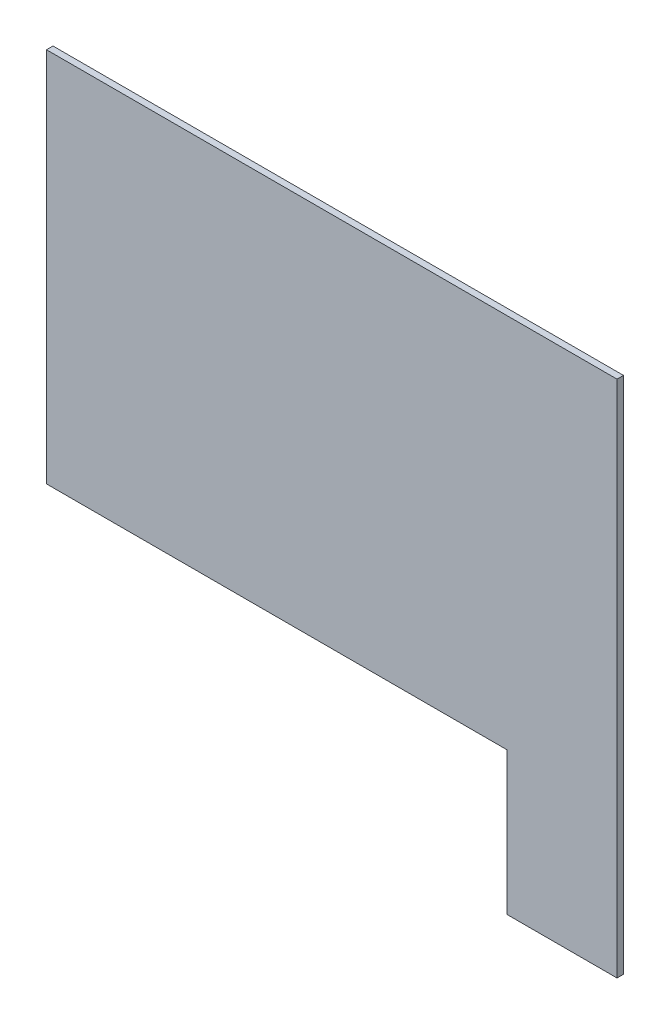
ISO-10303-21;
HEADER;
FILE_DESCRIPTION(('STEP AP214'),'2;1');
FILE_NAME('part.step','',(''),(''),'','','');
FILE_SCHEMA(('AUTOMOTIVE_DESIGN { 1 0 10303 214 1 1 1 1 }'));
ENDSEC;
DATA;
#1=APPLICATION_CONTEXT('core data for automotive mechanical design processes');
#2=APPLICATION_PROTOCOL_DEFINITION('international standard','automotive_design',2000,#1);
#3=PRODUCT_CONTEXT('',#1,'mechanical');
#4=PRODUCT('Part','Part','',(#3));
#5=PRODUCT_RELATED_PRODUCT_CATEGORY('part','',(#4));
#6=PRODUCT_DEFINITION_FORMATION('','',#4);
#7=PRODUCT_DEFINITION_CONTEXT('part definition',#1,'design');
#8=PRODUCT_DEFINITION('design','',#6,#7);
#9=PRODUCT_DEFINITION_SHAPE('','',#8);
#10=(LENGTH_UNIT() NAMED_UNIT(*) SI_UNIT(.MILLI.,.METRE.));
#11=(NAMED_UNIT(*) PLANE_ANGLE_UNIT() SI_UNIT($,.RADIAN.));
#12=(NAMED_UNIT(*) SI_UNIT($,.STERADIAN.) SOLID_ANGLE_UNIT());
#13=UNCERTAINTY_MEASURE_WITH_UNIT(LENGTH_MEASURE(1.E-05),#10,'distance_accuracy_value','');
#14=(GEOMETRIC_REPRESENTATION_CONTEXT(3) GLOBAL_UNCERTAINTY_ASSIGNED_CONTEXT((#13)) GLOBAL_UNIT_ASSIGNED_CONTEXT((#10,
#11,#12)) REPRESENTATION_CONTEXT('',''));
#15=CARTESIAN_POINT('',(0.,0.,0.));
#16=DIRECTION('',(0.,0.,1.));
#17=DIRECTION('',(1.,0.,0.));
#18=AXIS2_PLACEMENT_3D('',#15,#16,#17);
#19=CARTESIAN_POINT('',(228.58670680185,-2.29578903602801,5.));
#20=DIRECTION('',(0.,-1.,0.));
#21=DIRECTION('',(0.,0.,-1.));
#22=AXIS2_PLACEMENT_3D('',#19,#20,#21);
#23=PLANE('',#22);
#24=DIRECTION('',(-1.,0.,0.));
#25=VECTOR('',#24,1.);
#26=CARTESIAN_POINT('',(228.58670680185,-2.29578903602801,0.));
#27=LINE('',#26,#25);
#28=CARTESIAN_POINT('',(228.58670680185,-2.29578903602801,0.));
#29=VERTEX_POINT('',#28);
#30=CARTESIAN_POINT('',(-211.41329319815,-2.29578903602801,0.));
#31=VERTEX_POINT('',#30);
#32=EDGE_CURVE('E116',#29,#31,#27,.T.);
#33=ORIENTED_EDGE('',*,*,#32,.T.);
#34=DIRECTION('',(0.,0.,-1.));
#35=VECTOR('',#34,1.);
#36=CARTESIAN_POINT('',(-211.41329319815,-2.29578903602801,5.));
#37=LINE('',#36,#35);
#38=CARTESIAN_POINT('',(-211.41329319815,-2.29578903602801,5.));
#39=VERTEX_POINT('',#38);
#40=EDGE_CURVE('E11',#39,#31,#37,.T.);
#41=ORIENTED_EDGE('',*,*,#40,.F.);
#42=DIRECTION('',(-1.,0.,0.));
#43=VECTOR('',#42,1.);
#44=CARTESIAN_POINT('',(228.58670680185,-2.29578903602801,5.));
#45=LINE('',#44,#43);
#46=CARTESIAN_POINT('',(228.58670680185,-2.29578903602801,5.));
#47=VERTEX_POINT('',#46);
#48=EDGE_CURVE('E126',#47,#39,#45,.T.);
#49=ORIENTED_EDGE('',*,*,#48,.F.);
#50=DIRECTION('',(0.,0.,-1.));
#51=VECTOR('',#50,1.);
#52=CARTESIAN_POINT('',(228.58670680185,-2.29578903602801,5.));
#53=LINE('',#52,#51);
#54=EDGE_CURVE('E112',#47,#29,#53,.T.);
#55=ORIENTED_EDGE('',*,*,#54,.T.);
#56=EDGE_LOOP('',(#33,#41,#49,#55));
#57=FACE_BOUND('',#56,.T.);
#58=ADVANCED_FACE('F32',(#57),#23,.F.);
#59=CARTESIAN_POINT('',(-211.41329319815,-2.29578903602801,5.));
#60=DIRECTION('',(1.,0.,0.));
#61=DIRECTION('',(0.,0.,-1.));
#62=AXIS2_PLACEMENT_3D('',#59,#60,#61);
#63=PLANE('',#62);
#64=DIRECTION('',(0.,-1.,0.));
#65=VECTOR('',#64,1.);
#66=CARTESIAN_POINT('',(-211.41329319815,-2.29578903602801,0.));
#67=LINE('',#66,#65);
#68=CARTESIAN_POINT('',(-211.41329319815,-292.295789036028,0.));
#69=VERTEX_POINT('',#68);
#70=EDGE_CURVE('E119',#31,#69,#67,.T.);
#71=ORIENTED_EDGE('',*,*,#70,.T.);
#72=DIRECTION('',(0.,0.,-1.));
#73=VECTOR('',#72,1.);
#74=CARTESIAN_POINT('',(-211.41329319815,-292.295789036028,5.));
#75=LINE('',#74,#73);
#76=CARTESIAN_POINT('',(-211.41329319815,-292.295789036028,5.));
#77=VERTEX_POINT('',#76);
#78=EDGE_CURVE('E40',#77,#69,#75,.T.);
#79=ORIENTED_EDGE('',*,*,#78,.F.);
#80=DIRECTION('',(0.,-1.,0.));
#81=VECTOR('',#80,1.);
#82=CARTESIAN_POINT('',(-211.41329319815,-2.29578903602801,5.));
#83=LINE('',#82,#81);
#84=EDGE_CURVE('E85',#39,#77,#83,.T.);
#85=ORIENTED_EDGE('',*,*,#84,.F.);
#86=ORIENTED_EDGE('',*,*,#40,.T.);
#87=EDGE_LOOP('',(#71,#79,#85,#86));
#88=FACE_BOUND('',#87,.T.);
#89=ADVANCED_FACE('F150',(#88),#63,.F.);
#90=CARTESIAN_POINT('',(-211.41329319815,-292.295789036028,5.));
#91=DIRECTION('',(0.,1.,0.));
#92=DIRECTION('',(-1.,0.,0.));
#93=AXIS2_PLACEMENT_3D('',#90,#91,#92);
#94=PLANE('',#93);
#95=DIRECTION('',(1.,0.,0.));
#96=VECTOR('',#95,1.);
#97=CARTESIAN_POINT('',(-211.41329319815,-292.295789036028,0.));
#98=LINE('',#97,#96);
#99=CARTESIAN_POINT('',(143.58670680185,-292.295789036028,0.));
#100=VERTEX_POINT('',#99);
#101=EDGE_CURVE('E121',#69,#100,#98,.T.);
#102=ORIENTED_EDGE('',*,*,#101,.T.);
#103=DIRECTION('',(0.,0.,-1.));
#104=VECTOR('',#103,1.);
#105=CARTESIAN_POINT('',(143.58670680185,-292.295789036028,5.));
#106=LINE('',#105,#104);
#107=CARTESIAN_POINT('',(143.58670680185,-292.295789036028,5.));
#108=VERTEX_POINT('',#107);
#109=EDGE_CURVE('E107',#108,#100,#106,.T.);
#110=ORIENTED_EDGE('',*,*,#109,.F.);
#111=DIRECTION('',(1.,0.,0.));
#112=VECTOR('',#111,1.);
#113=CARTESIAN_POINT('',(-211.41329319815,-292.295789036028,5.));
#114=LINE('',#113,#112);
#115=EDGE_CURVE('E98',#77,#108,#114,.T.);
#116=ORIENTED_EDGE('',*,*,#115,.F.);
#117=ORIENTED_EDGE('',*,*,#78,.T.);
#118=EDGE_LOOP('',(#102,#110,#116,#117));
#119=FACE_BOUND('',#118,.T.);
#120=ADVANCED_FACE('F132',(#119),#94,.F.);
#121=CARTESIAN_POINT('',(143.58670680185,-292.295789036028,5.));
#122=DIRECTION('',(1.,0.,0.));
#123=DIRECTION('',(0.,1.,0.));
#124=AXIS2_PLACEMENT_3D('',#121,#122,#123);
#125=PLANE('',#124);
#126=DIRECTION('',(0.,-1.,0.));
#127=VECTOR('',#126,1.);
#128=CARTESIAN_POINT('',(143.58670680185,-292.295789036028,0.));
#129=LINE('',#128,#127);
#130=CARTESIAN_POINT('',(143.58670680185,-402.295789036028,0.));
#131=VERTEX_POINT('',#130);
#132=EDGE_CURVE('E106',#100,#131,#129,.T.);
#133=ORIENTED_EDGE('',*,*,#132,.T.);
#134=DIRECTION('',(0.,0.,-1.));
#135=VECTOR('',#134,1.);
#136=CARTESIAN_POINT('',(143.58670680185,-402.295789036028,5.));
#137=LINE('',#136,#135);
#138=CARTESIAN_POINT('',(143.58670680185,-402.295789036028,5.));
#139=VERTEX_POINT('',#138);
#140=EDGE_CURVE('E103',#139,#131,#137,.T.);
#141=ORIENTED_EDGE('',*,*,#140,.F.);
#142=DIRECTION('',(0.,-1.,0.));
#143=VECTOR('',#142,1.);
#144=CARTESIAN_POINT('',(143.58670680185,-292.295789036028,5.));
#145=LINE('',#144,#143);
#146=EDGE_CURVE('E92',#108,#139,#145,.T.);
#147=ORIENTED_EDGE('',*,*,#146,.F.);
#148=ORIENTED_EDGE('',*,*,#109,.T.);
#149=EDGE_LOOP('',(#133,#141,#147,#148));
#150=FACE_BOUND('',#149,.T.);
#151=ADVANCED_FACE('F104',(#150),#125,.F.);
#152=CARTESIAN_POINT('',(143.58670680185,-402.295789036028,5.));
#153=DIRECTION('',(0.,1.,0.));
#154=DIRECTION('',(0.,0.,1.));
#155=AXIS2_PLACEMENT_3D('',#152,#153,#154);
#156=PLANE('',#155);
#157=DIRECTION('',(1.,0.,0.));
#158=VECTOR('',#157,1.);
#159=CARTESIAN_POINT('',(143.58670680185,-402.295789036028,0.));
#160=LINE('',#159,#158);
#161=CARTESIAN_POINT('',(228.58670680185,-402.295789036028,0.));
#162=VERTEX_POINT('',#161);
#163=EDGE_CURVE('E71',#131,#162,#160,.T.);
#164=ORIENTED_EDGE('',*,*,#163,.T.);
#165=DIRECTION('',(0.,0.,-1.));
#166=VECTOR('',#165,1.);
#167=CARTESIAN_POINT('',(228.58670680185,-402.295789036028,5.));
#168=LINE('',#167,#166);
#169=CARTESIAN_POINT('',(228.58670680185,-402.295789036028,5.));
#170=VERTEX_POINT('',#169);
#171=EDGE_CURVE('E108',#170,#162,#168,.T.);
#172=ORIENTED_EDGE('',*,*,#171,.F.);
#173=DIRECTION('',(1.,0.,0.));
#174=VECTOR('',#173,1.);
#175=CARTESIAN_POINT('',(143.58670680185,-402.295789036028,5.));
#176=LINE('',#175,#174);
#177=EDGE_CURVE('E96',#139,#170,#176,.T.);
#178=ORIENTED_EDGE('',*,*,#177,.F.);
#179=ORIENTED_EDGE('',*,*,#140,.T.);
#180=EDGE_LOOP('',(#164,#172,#178,#179));
#181=FACE_BOUND('',#180,.T.);
#182=ADVANCED_FACE('F110',(#181),#156,.F.);
#183=CARTESIAN_POINT('',(228.58670680185,-2.29578903602801,5.));
#184=DIRECTION('',(-1.,0.,0.));
#185=DIRECTION('',(0.,0.,1.));
#186=AXIS2_PLACEMENT_3D('',#183,#184,#185);
#187=PLANE('',#186);
#188=DIRECTION('',(0.,1.,0.));
#189=VECTOR('',#188,1.);
#190=CARTESIAN_POINT('',(228.58670680185,-2.29578903602801,0.));
#191=LINE('',#190,#189);
#192=EDGE_CURVE('E77',#162,#29,#191,.T.);
#193=ORIENTED_EDGE('',*,*,#192,.T.);
#194=ORIENTED_EDGE('',*,*,#54,.F.);
#195=DIRECTION('',(0.,1.,0.));
#196=VECTOR('',#195,1.);
#197=CARTESIAN_POINT('',(228.58670680185,-2.29578903602801,5.));
#198=LINE('',#197,#196);
#199=EDGE_CURVE('E48',#170,#47,#198,.T.);
#200=ORIENTED_EDGE('',*,*,#199,.F.);
#201=ORIENTED_EDGE('',*,*,#171,.T.);
#202=EDGE_LOOP('',(#193,#194,#200,#201));
#203=FACE_BOUND('',#202,.T.);
#204=ADVANCED_FACE('F139',(#203),#187,.F.);
#205=CARTESIAN_POINT('',(0.,0.,5.));
#206=DIRECTION('',(0.,0.,1.));
#207=DIRECTION('',(1.,0.,0.));
#208=AXIS2_PLACEMENT_3D('',#205,#206,#207);
#209=PLANE('',#208);
#210=ORIENTED_EDGE('',*,*,#48,.T.);
#211=ORIENTED_EDGE('',*,*,#84,.T.);
#212=ORIENTED_EDGE('',*,*,#115,.T.);
#213=ORIENTED_EDGE('',*,*,#146,.T.);
#214=ORIENTED_EDGE('',*,*,#177,.T.);
#215=ORIENTED_EDGE('',*,*,#199,.T.);
#216=EDGE_LOOP('',(#210,#211,#212,#213,#214,#215));
#217=FACE_BOUND('',#216,.T.);
#218=ADVANCED_FACE('F94',(#217),#209,.T.);
#219=CARTESIAN_POINT('',(0.,0.,0.));
#220=DIRECTION('',(0.,0.,1.));
#221=DIRECTION('',(1.,0.,0.));
#222=AXIS2_PLACEMENT_3D('',#219,#220,#221);
#223=PLANE('',#222);
#224=ORIENTED_EDGE('',*,*,#32,.F.);
#225=ORIENTED_EDGE('',*,*,#192,.F.);
#226=ORIENTED_EDGE('',*,*,#163,.F.);
#227=ORIENTED_EDGE('',*,*,#132,.F.);
#228=ORIENTED_EDGE('',*,*,#101,.F.);
#229=ORIENTED_EDGE('',*,*,#70,.F.);
#230=EDGE_LOOP('',(#224,#225,#226,#227,#228,#229));
#231=FACE_BOUND('',#230,.T.);
#232=ADVANCED_FACE('F135',(#231),#223,.F.);
#233=CLOSED_SHELL('',(#58,#89,#120,#151,#182,#204,#218,#232));
#234=MANIFOLD_SOLID_BREP('B2',#233);
#235=ADVANCED_BREP_SHAPE_REPRESENTATION('',(#18,#234),#14);
#236=SHAPE_DEFINITION_REPRESENTATION(#9,#235);
ENDSEC;
END-ISO-10303-21;
